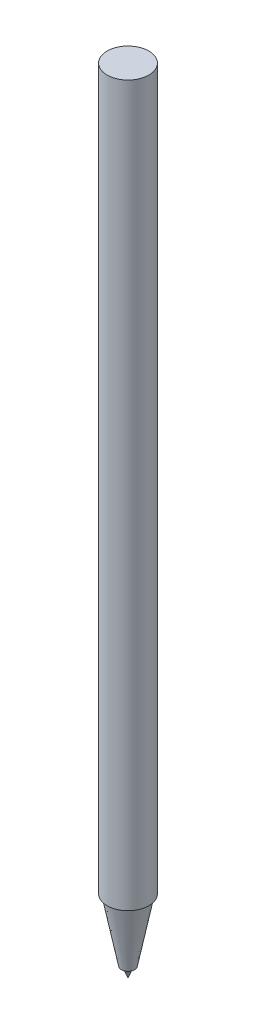
ISO-10303-21;
HEADER;
FILE_DESCRIPTION(('STEP AP214'),'2;1');
FILE_NAME('part.step','',(''),(''),'','','');
FILE_SCHEMA(('AUTOMOTIVE_DESIGN { 1 0 10303 214 1 1 1 1 }'));
ENDSEC;
DATA;
#1=APPLICATION_CONTEXT('core data for automotive mechanical design processes');
#2=APPLICATION_PROTOCOL_DEFINITION('international standard','automotive_design',2000,#1);
#3=PRODUCT_CONTEXT('',#1,'mechanical');
#4=PRODUCT('Part','Part','',(#3));
#5=PRODUCT_RELATED_PRODUCT_CATEGORY('part','',(#4));
#6=PRODUCT_DEFINITION_FORMATION('','',#4);
#7=PRODUCT_DEFINITION_CONTEXT('part definition',#1,'design');
#8=PRODUCT_DEFINITION('design','',#6,#7);
#9=PRODUCT_DEFINITION_SHAPE('','',#8);
#10=(LENGTH_UNIT() NAMED_UNIT(*) SI_UNIT(.MILLI.,.METRE.));
#11=(NAMED_UNIT(*) PLANE_ANGLE_UNIT() SI_UNIT($,.RADIAN.));
#12=(NAMED_UNIT(*) SI_UNIT($,.STERADIAN.) SOLID_ANGLE_UNIT());
#13=UNCERTAINTY_MEASURE_WITH_UNIT(LENGTH_MEASURE(1.E-05),#10,'distance_accuracy_value','');
#14=(GEOMETRIC_REPRESENTATION_CONTEXT(3) GLOBAL_UNCERTAINTY_ASSIGNED_CONTEXT((#13)) GLOBAL_UNIT_ASSIGNED_CONTEXT((#10,
#11,#12)) REPRESENTATION_CONTEXT('',''));
#15=CARTESIAN_POINT('',(0.,0.,0.));
#16=DIRECTION('',(0.,0.,1.));
#17=DIRECTION('',(1.,0.,0.));
#18=AXIS2_PLACEMENT_3D('',#15,#16,#17);
#19=CARTESIAN_POINT('',(0.,138.,0.));
#20=DIRECTION('',(0.,-1.,0.));
#21=DIRECTION('',(0.,0.,-1.));
#22=AXIS2_PLACEMENT_3D('',#19,#20,#21);
#23=CYLINDRICAL_SURFACE('',#22,4.);
#24=CARTESIAN_POINT('',(0.,138.,0.));
#25=DIRECTION('',(0.,1.,0.));
#26=DIRECTION('',(0.,0.,1.));
#27=AXIS2_PLACEMENT_3D('',#24,#25,#26);
#28=CIRCLE('',#27,4.);
#29=CARTESIAN_POINT('',(0.,138.,4.));
#30=VERTEX_POINT('',#29);
#31=EDGE_CURVE('E39',#30,#30,#28,.T.);
#32=ORIENTED_EDGE('',*,*,#31,.F.);
#33=EDGE_LOOP('',(#32));
#34=FACE_BOUND('',#33,.T.);
#35=CARTESIAN_POINT('',(0.,0.,0.));
#36=DIRECTION('',(0.,1.,0.));
#37=DIRECTION('',(0.,0.,1.));
#38=AXIS2_PLACEMENT_3D('',#35,#36,#37);
#39=CIRCLE('',#38,4.);
#40=CARTESIAN_POINT('',(0.,0.,4.));
#41=VERTEX_POINT('',#40);
#42=EDGE_CURVE('E35',#41,#41,#39,.T.);
#43=ORIENTED_EDGE('',*,*,#42,.T.);
#44=EDGE_LOOP('',(#43));
#45=FACE_BOUND('',#44,.T.);
#46=ADVANCED_FACE('F32',(#34,#45),#23,.T.);
#47=CARTESIAN_POINT('',(0.,138.,0.));
#48=DIRECTION('',(0.,1.,0.));
#49=DIRECTION('',(0.,0.,1.));
#50=AXIS2_PLACEMENT_3D('',#47,#48,#49);
#51=PLANE('',#50);
#52=ORIENTED_EDGE('',*,*,#31,.T.);
#53=EDGE_LOOP('',(#52));
#54=FACE_BOUND('',#53,.T.);
#55=ADVANCED_FACE('F66',(#54),#51,.T.);
#56=CARTESIAN_POINT('',(0.,0.,0.));
#57=DIRECTION('',(0.,1.,0.));
#58=DIRECTION('',(0.,0.,1.));
#59=AXIS2_PLACEMENT_3D('',#56,#57,#58);
#60=PLANE('',#59);
#61=CARTESIAN_POINT('',(0.,0.,0.));
#62=DIRECTION('',(0.,-1.,0.));
#63=DIRECTION('',(0.,0.,-1.));
#64=AXIS2_PLACEMENT_3D('',#61,#62,#63);
#65=CIRCLE('',#64,3.6);
#66=CARTESIAN_POINT('',(0.,0.,-3.6));
#67=VERTEX_POINT('',#66);
#68=EDGE_CURVE('E11',#67,#67,#65,.T.);
#69=ORIENTED_EDGE('',*,*,#68,.F.);
#70=EDGE_LOOP('',(#69));
#71=FACE_BOUND('',#70,.T.);
#72=ORIENTED_EDGE('',*,*,#42,.F.);
#73=EDGE_LOOP('',(#72));
#74=FACE_BOUND('',#73,.T.);
#75=ADVANCED_FACE('F63',(#71,#74),#60,.F.);
#76=CARTESIAN_POINT('',(0.,0.,0.));
#77=DIRECTION('',(0.,1.,0.));
#78=DIRECTION('',(0.,0.,-1.));
#79=AXIS2_PLACEMENT_3D('',#76,#77,#78);
#80=CONICAL_SURFACE('',#79,3.6,0.191986217719376);
#81=CARTESIAN_POINT('',(0.,-12.,0.));
#82=DIRECTION('',(0.,-1.,0.));
#83=DIRECTION('',(0.,0.,-1.));
#84=AXIS2_PLACEMENT_3D('',#81,#82,#83);
#85=CIRCLE('',#84,1.26743629034738);
#86=CARTESIAN_POINT('',(0.,-12.,-1.26743629034738));
#87=VERTEX_POINT('',#86);
#88=EDGE_CURVE('E52',#87,#87,#85,.T.);
#89=ORIENTED_EDGE('',*,*,#88,.F.);
#90=EDGE_LOOP('',(#89));
#91=FACE_BOUND('',#90,.T.);
#92=ORIENTED_EDGE('',*,*,#68,.T.);
#93=EDGE_LOOP('',(#92));
#94=FACE_BOUND('',#93,.T.);
#95=ADVANCED_FACE('F65',(#91,#94),#80,.T.);
#96=CARTESIAN_POINT('',(0.,-12.,0.));
#97=DIRECTION('',(0.,-1.,0.));
#98=DIRECTION('',(0.,0.,-1.));
#99=AXIS2_PLACEMENT_3D('',#96,#97,#98);
#100=PLANE('',#99);
#101=CARTESIAN_POINT('',(0.,-12.,0.));
#102=DIRECTION('',(0.,-1.,0.));
#103=DIRECTION('',(0.,0.,-1.));
#104=AXIS2_PLACEMENT_3D('',#101,#102,#103);
#105=CIRCLE('',#104,0.767436290347377);
#106=CARTESIAN_POINT('',(0.,-12.,-0.767436290347377));
#107=VERTEX_POINT('',#106);
#108=EDGE_CURVE('E50',#107,#107,#105,.T.);
#109=ORIENTED_EDGE('',*,*,#108,.F.);
#110=EDGE_LOOP('',(#109));
#111=FACE_BOUND('',#110,.T.);
#112=ORIENTED_EDGE('',*,*,#88,.T.);
#113=EDGE_LOOP('',(#112));
#114=FACE_BOUND('',#113,.T.);
#115=ADVANCED_FACE('F46',(#111,#114),#100,.T.);
#116=CARTESIAN_POINT('',(0.,-12.,0.));
#117=DIRECTION('',(0.,1.,0.));
#118=DIRECTION('',(0.,0.,-1.));
#119=AXIS2_PLACEMENT_3D('',#116,#117,#118);
#120=CONICAL_SURFACE('',#119,0.767436290347377,0.366519142918809);
#121=CARTESIAN_POINT('',(0.,-13.9992398878331,0.));
#122=VERTEX_POINT('',#121);
#123=VERTEX_LOOP('',#122);
#124=FACE_BOUND('',#123,.T.);
#125=ORIENTED_EDGE('',*,*,#108,.T.);
#126=EDGE_LOOP('',(#125));
#127=FACE_BOUND('',#126,.T.);
#128=ADVANCED_FACE('F43',(#124,#127),#120,.T.);
#129=CLOSED_SHELL('',(#46,#55,#75,#95,#115,#128));
#130=MANIFOLD_SOLID_BREP('B2',#129);
#131=ADVANCED_BREP_SHAPE_REPRESENTATION('',(#18,#130),#14);
#132=SHAPE_DEFINITION_REPRESENTATION(#9,#131);
ENDSEC;
END-ISO-10303-21;
